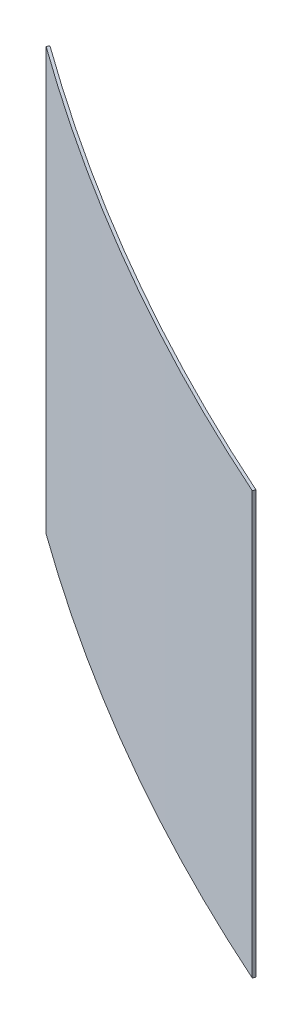
ISO-10303-21;
HEADER;
FILE_DESCRIPTION(('STEP AP214'),'2;1');
FILE_NAME('part.step','',(''),(''),'','','');
FILE_SCHEMA(('AUTOMOTIVE_DESIGN { 1 0 10303 214 1 1 1 1 }'));
ENDSEC;
DATA;
#1=APPLICATION_CONTEXT('core data for automotive mechanical design processes');
#2=APPLICATION_PROTOCOL_DEFINITION('international standard','automotive_design',2000,#1);
#3=PRODUCT_CONTEXT('',#1,'mechanical');
#4=PRODUCT('Part','Part','',(#3));
#5=PRODUCT_RELATED_PRODUCT_CATEGORY('part','',(#4));
#6=PRODUCT_DEFINITION_FORMATION('','',#4);
#7=PRODUCT_DEFINITION_CONTEXT('part definition',#1,'design');
#8=PRODUCT_DEFINITION('design','',#6,#7);
#9=PRODUCT_DEFINITION_SHAPE('','',#8);
#10=(LENGTH_UNIT() NAMED_UNIT(*) SI_UNIT(.MILLI.,.METRE.));
#11=(NAMED_UNIT(*) PLANE_ANGLE_UNIT() SI_UNIT($,.RADIAN.));
#12=(NAMED_UNIT(*) SI_UNIT($,.STERADIAN.) SOLID_ANGLE_UNIT());
#13=UNCERTAINTY_MEASURE_WITH_UNIT(LENGTH_MEASURE(1.E-05),#10,'distance_accuracy_value','');
#14=(GEOMETRIC_REPRESENTATION_CONTEXT(3) GLOBAL_UNCERTAINTY_ASSIGNED_CONTEXT((#13)) GLOBAL_UNIT_ASSIGNED_CONTEXT((#10,
#11,#12)) REPRESENTATION_CONTEXT('',''));
#15=CARTESIAN_POINT('',(0.,0.,0.));
#16=DIRECTION('',(0.,0.,1.));
#17=DIRECTION('',(1.,0.,0.));
#18=AXIS2_PLACEMENT_3D('',#15,#16,#17);
#19=CARTESIAN_POINT('',(0.,75.,0.));
#20=DIRECTION('',(0.,-1.,0.));
#21=DIRECTION('',(0.,0.,-1.));
#22=AXIS2_PLACEMENT_3D('',#19,#20,#21);
#23=CYLINDRICAL_SURFACE('',#22,986.5);
#24=CARTESIAN_POINT('',(0.,-75.,0.));
#25=DIRECTION('',(0.,1.,0.));
#26=DIRECTION('',(1.,0.,0.));
#27=AXIS2_PLACEMENT_3D('',#24,#25,#26);
#28=CIRCLE('',#27,986.5);
#29=CARTESIAN_POINT('',(-577.394489215083,-75.,799.87364866212));
#30=VERTEX_POINT('',#29);
#31=CARTESIAN_POINT('',(-404.013654951592,-75.,899.975119996467));
#32=VERTEX_POINT('',#31);
#33=EDGE_CURVE('E101',#30,#32,#28,.T.);
#34=ORIENTED_EDGE('',*,*,#33,.T.);
#35=DIRECTION('',(0.,-1.,0.));
#36=VECTOR('',#35,1.);
#37=CARTESIAN_POINT('',(-404.013654951592,75.,899.975119996467));
#38=LINE('',#37,#36);
#39=CARTESIAN_POINT('',(-404.013654951592,75.,899.975119996467));
#40=VERTEX_POINT('',#39);
#41=EDGE_CURVE('E11',#40,#32,#38,.T.);
#42=ORIENTED_EDGE('',*,*,#41,.F.);
#43=CARTESIAN_POINT('',(0.,75.,0.));
#44=DIRECTION('',(0.,1.,0.));
#45=DIRECTION('',(1.,0.,0.));
#46=AXIS2_PLACEMENT_3D('',#43,#44,#45);
#47=CIRCLE('',#46,986.5);
#48=CARTESIAN_POINT('',(-577.394489215083,75.,799.87364866212));
#49=VERTEX_POINT('',#48);
#50=EDGE_CURVE('E78',#49,#40,#47,.T.);
#51=ORIENTED_EDGE('',*,*,#50,.F.);
#52=DIRECTION('',(0.,-1.,0.));
#53=VECTOR('',#52,1.);
#54=CARTESIAN_POINT('',(-577.394489215083,75.,799.87364866212));
#55=LINE('',#54,#53);
#56=EDGE_CURVE('E54',#49,#30,#55,.T.);
#57=ORIENTED_EDGE('',*,*,#56,.T.);
#58=EDGE_LOOP('',(#34,#42,#51,#57));
#59=FACE_BOUND('',#58,.T.);
#60=ADVANCED_FACE('F38',(#59),#23,.T.);
#61=CARTESIAN_POINT('',(-403.604112473182,75.,899.062828947307));
#62=DIRECTION('',(0.91229104916015,0.,0.409542478410083));
#63=DIRECTION('',(0.409542478410083,0.,-0.91229104916015));
#64=AXIS2_PLACEMENT_3D('',#61,#62,#63);
#65=PLANE('',#64);
#66=DIRECTION('',(-0.409542478410083,0.,0.91229104916015));
#67=VECTOR('',#66,1.);
#68=CARTESIAN_POINT('',(-403.604112473182,-75.,899.062828947307));
#69=LINE('',#68,#67);
#70=CARTESIAN_POINT('',(-403.604112473182,-75.,899.062828947307));
#71=VERTEX_POINT('',#70);
#72=EDGE_CURVE('E87',#71,#32,#69,.T.);
#73=ORIENTED_EDGE('',*,*,#72,.F.);
#74=DIRECTION('',(0.,-1.,0.));
#75=VECTOR('',#74,1.);
#76=CARTESIAN_POINT('',(-403.604112473182,75.,899.062828947307));
#77=LINE('',#76,#75);
#78=CARTESIAN_POINT('',(-403.604112473182,75.,899.062828947307));
#79=VERTEX_POINT('',#78);
#80=EDGE_CURVE('E46',#79,#71,#77,.T.);
#81=ORIENTED_EDGE('',*,*,#80,.F.);
#82=DIRECTION('',(-0.409542478410083,0.,0.91229104916015));
#83=VECTOR('',#82,1.);
#84=CARTESIAN_POINT('',(-403.604112473182,75.,899.062828947307));
#85=LINE('',#84,#83);
#86=EDGE_CURVE('E85',#79,#40,#85,.T.);
#87=ORIENTED_EDGE('',*,*,#86,.T.);
#88=ORIENTED_EDGE('',*,*,#41,.T.);
#89=EDGE_LOOP('',(#73,#81,#87,#88));
#90=FACE_BOUND('',#89,.T.);
#91=ADVANCED_FACE('F84',(#90),#65,.T.);
#92=CARTESIAN_POINT('',(0.,75.,0.));
#93=DIRECTION('',(0.,-1.,0.));
#94=DIRECTION('',(0.,0.,-1.));
#95=AXIS2_PLACEMENT_3D('',#92,#93,#94);
#96=CYLINDRICAL_SURFACE('',#95,985.5);
#97=CARTESIAN_POINT('',(0.,-75.,0.));
#98=DIRECTION('',(0.,1.,0.));
#99=DIRECTION('',(0.,0.,1.));
#100=AXIS2_PLACEMENT_3D('',#97,#98,#99);
#101=CIRCLE('',#100,985.5);
#102=CARTESIAN_POINT('',(-576.809193230071,-75.,799.062828947308));
#103=VERTEX_POINT('',#102);
#104=EDGE_CURVE('E104',#103,#71,#101,.T.);
#105=ORIENTED_EDGE('',*,*,#104,.F.);
#106=DIRECTION('',(0.,-1.,0.));
#107=VECTOR('',#106,1.);
#108=CARTESIAN_POINT('',(-576.809193230071,75.,799.062828947308));
#109=LINE('',#108,#107);
#110=CARTESIAN_POINT('',(-576.809193230071,75.,799.062828947308));
#111=VERTEX_POINT('',#110);
#112=EDGE_CURVE('E67',#111,#103,#109,.T.);
#113=ORIENTED_EDGE('',*,*,#112,.F.);
#114=CARTESIAN_POINT('',(0.,75.,0.));
#115=DIRECTION('',(0.,1.,0.));
#116=DIRECTION('',(0.,0.,1.));
#117=AXIS2_PLACEMENT_3D('',#114,#115,#116);
#118=CIRCLE('',#117,985.5);
#119=EDGE_CURVE('E93',#111,#79,#118,.T.);
#120=ORIENTED_EDGE('',*,*,#119,.T.);
#121=ORIENTED_EDGE('',*,*,#80,.T.);
#122=EDGE_LOOP('',(#105,#113,#120,#121));
#123=FACE_BOUND('',#122,.T.);
#124=ADVANCED_FACE('F95',(#123),#96,.F.);
#125=CARTESIAN_POINT('',(-577.394489215083,75.,799.87364866212));
#126=DIRECTION('',(-0.810819714812174,0.,-0.58529598501263));
#127=DIRECTION('',(-0.58529598501263,0.,0.810819714812174));
#128=AXIS2_PLACEMENT_3D('',#125,#126,#127);
#129=PLANE('',#128);
#130=DIRECTION('',(0.58529598501263,0.,-0.810819714812174));
#131=VECTOR('',#130,1.);
#132=CARTESIAN_POINT('',(-577.394489215083,-75.,799.87364866212));
#133=LINE('',#132,#131);
#134=EDGE_CURVE('E106',#30,#103,#133,.T.);
#135=ORIENTED_EDGE('',*,*,#134,.F.);
#136=ORIENTED_EDGE('',*,*,#56,.F.);
#137=DIRECTION('',(0.58529598501263,0.,-0.810819714812174));
#138=VECTOR('',#137,1.);
#139=CARTESIAN_POINT('',(-577.394489215083,75.,799.87364866212));
#140=LINE('',#139,#138);
#141=EDGE_CURVE('E96',#49,#111,#140,.T.);
#142=ORIENTED_EDGE('',*,*,#141,.T.);
#143=ORIENTED_EDGE('',*,*,#112,.T.);
#144=EDGE_LOOP('',(#135,#136,#142,#143));
#145=FACE_BOUND('',#144,.T.);
#146=ADVANCED_FACE('F112',(#145),#129,.T.);
#147=CARTESIAN_POINT('',(0.,75.,0.));
#148=DIRECTION('',(0.,1.,0.));
#149=DIRECTION('',(1.,0.,0.));
#150=AXIS2_PLACEMENT_3D('',#147,#148,#149);
#151=PLANE('',#150);
#152=ORIENTED_EDGE('',*,*,#50,.T.);
#153=ORIENTED_EDGE('',*,*,#86,.F.);
#154=ORIENTED_EDGE('',*,*,#119,.F.);
#155=ORIENTED_EDGE('',*,*,#141,.F.);
#156=EDGE_LOOP('',(#152,#153,#154,#155));
#157=FACE_BOUND('',#156,.T.);
#158=ADVANCED_FACE('F92',(#157),#151,.T.);
#159=CARTESIAN_POINT('',(0.,-75.,0.));
#160=DIRECTION('',(0.,1.,0.));
#161=DIRECTION('',(1.,0.,0.));
#162=AXIS2_PLACEMENT_3D('',#159,#160,#161);
#163=PLANE('',#162);
#164=ORIENTED_EDGE('',*,*,#33,.F.);
#165=ORIENTED_EDGE('',*,*,#134,.T.);
#166=ORIENTED_EDGE('',*,*,#104,.T.);
#167=ORIENTED_EDGE('',*,*,#72,.T.);
#168=EDGE_LOOP('',(#164,#165,#166,#167));
#169=FACE_BOUND('',#168,.T.);
#170=ADVANCED_FACE('F111',(#169),#163,.F.);
#171=CLOSED_SHELL('',(#60,#91,#124,#146,#158,#170));
#172=MANIFOLD_SOLID_BREP('B2',#171);
#173=ADVANCED_BREP_SHAPE_REPRESENTATION('',(#18,#172),#14);
#174=SHAPE_DEFINITION_REPRESENTATION(#9,#173);
ENDSEC;
END-ISO-10303-21;
